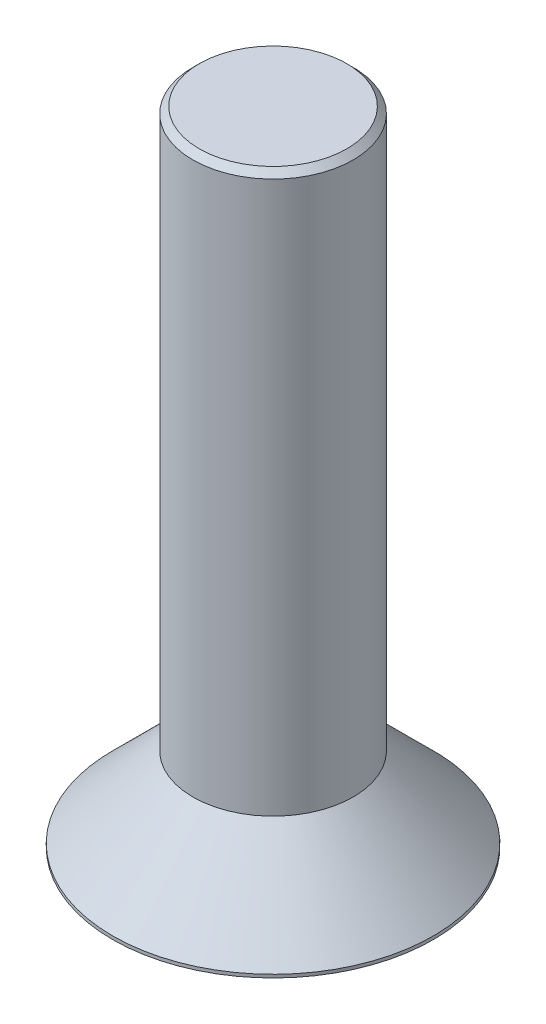
ISO-10303-21;
HEADER;
FILE_DESCRIPTION(('STEP AP214'),'2;1');
FILE_NAME('part.step','',(''),(''),'','','');
FILE_SCHEMA(('AUTOMOTIVE_DESIGN { 1 0 10303 214 1 1 1 1 }'));
ENDSEC;
DATA;
#1=APPLICATION_CONTEXT('core data for automotive mechanical design processes');
#2=APPLICATION_PROTOCOL_DEFINITION('international standard','automotive_design',2000,#1);
#3=PRODUCT_CONTEXT('',#1,'mechanical');
#4=PRODUCT('Part','Part','',(#3));
#5=PRODUCT_RELATED_PRODUCT_CATEGORY('part','',(#4));
#6=PRODUCT_DEFINITION_FORMATION('','',#4);
#7=PRODUCT_DEFINITION_CONTEXT('part definition',#1,'design');
#8=PRODUCT_DEFINITION('design','',#6,#7);
#9=PRODUCT_DEFINITION_SHAPE('','',#8);
#10=(LENGTH_UNIT() NAMED_UNIT(*) SI_UNIT(.MILLI.,.METRE.));
#11=(NAMED_UNIT(*) PLANE_ANGLE_UNIT() SI_UNIT($,.RADIAN.));
#12=(NAMED_UNIT(*) SI_UNIT($,.STERADIAN.) SOLID_ANGLE_UNIT());
#13=UNCERTAINTY_MEASURE_WITH_UNIT(LENGTH_MEASURE(1.E-05),#10,'distance_accuracy_value','');
#14=(GEOMETRIC_REPRESENTATION_CONTEXT(3) GLOBAL_UNCERTAINTY_ASSIGNED_CONTEXT((#13)) GLOBAL_UNIT_ASSIGNED_CONTEXT((#10,
#11,#12)) REPRESENTATION_CONTEXT('',''));
#15=CARTESIAN_POINT('',(0.,0.,0.));
#16=DIRECTION('',(0.,0.,1.));
#17=DIRECTION('',(1.,0.,0.));
#18=AXIS2_PLACEMENT_3D('',#15,#16,#17);
#19=CARTESIAN_POINT('',(0.,2.6,0.));
#20=DIRECTION('',(0.,-1.,0.));
#21=DIRECTION('',(0.,0.,-1.));
#22=AXIS2_PLACEMENT_3D('',#19,#20,#21);
#23=CYLINDRICAL_SURFACE('',#22,5.);
#24=CARTESIAN_POINT('',(0.,0.0999999999999916,0.));
#25=DIRECTION('',(0.,1.,0.));
#26=DIRECTION('',(0.,0.,1.));
#27=AXIS2_PLACEMENT_3D('',#24,#25,#26);
#28=CIRCLE('',#27,5.);
#29=CARTESIAN_POINT('',(0.,0.0999999999999916,5.));
#30=VERTEX_POINT('',#29);
#31=EDGE_CURVE('E151',#30,#30,#28,.F.);
#32=ORIENTED_EDGE('',*,*,#31,.T.);
#33=EDGE_LOOP('',(#32));
#34=FACE_BOUND('',#33,.T.);
#35=CARTESIAN_POINT('',(0.,0.,0.));
#36=DIRECTION('',(0.,1.,0.));
#37=DIRECTION('',(0.,0.,1.));
#38=AXIS2_PLACEMENT_3D('',#35,#36,#37);
#39=CIRCLE('',#38,5.);
#40=CARTESIAN_POINT('',(0.,0.,5.));
#41=VERTEX_POINT('',#40);
#42=EDGE_CURVE('E140',#41,#41,#39,.T.);
#43=ORIENTED_EDGE('',*,*,#42,.T.);
#44=EDGE_LOOP('',(#43));
#45=FACE_BOUND('',#44,.T.);
#46=ADVANCED_FACE('F37',(#34,#45),#23,.T.);
#47=CARTESIAN_POINT('',(0.,0.,0.));
#48=DIRECTION('',(0.,1.,0.));
#49=DIRECTION('',(0.,0.,1.));
#50=AXIS2_PLACEMENT_3D('',#47,#48,#49);
#51=PLANE('',#50);
#52=DIRECTION('',(0.,0.,1.));
#53=VECTOR('',#52,1.);
#54=CARTESIAN_POINT('',(1.54,0.,-0.889119414552024));
#55=LINE('',#54,#53);
#56=CARTESIAN_POINT('',(1.54,0.,-0.889119414552024));
#57=VERTEX_POINT('',#56);
#58=CARTESIAN_POINT('',(1.54,0.,0.889119414552024));
#59=VERTEX_POINT('',#58);
#60=EDGE_CURVE('E127',#57,#59,#55,.T.);
#61=ORIENTED_EDGE('',*,*,#60,.F.);
#62=DIRECTION('',(0.866025403784439,0.,0.5));
#63=VECTOR('',#62,1.);
#64=CARTESIAN_POINT('',(0.,0.,-1.77823882910405));
#65=LINE('',#64,#63);
#66=CARTESIAN_POINT('',(0.,0.,-1.77823882910405));
#67=VERTEX_POINT('',#66);
#68=EDGE_CURVE('E53',#67,#57,#65,.T.);
#69=ORIENTED_EDGE('',*,*,#68,.F.);
#70=DIRECTION('',(0.866025403784438,0.,-0.5));
#71=VECTOR('',#70,1.);
#72=CARTESIAN_POINT('',(-1.54,0.,-0.889119414552024));
#73=LINE('',#72,#71);
#74=CARTESIAN_POINT('',(-1.54,0.,-0.889119414552024));
#75=VERTEX_POINT('',#74);
#76=EDGE_CURVE('E136',#75,#67,#73,.T.);
#77=ORIENTED_EDGE('',*,*,#76,.F.);
#78=DIRECTION('',(0.,0.,-1.));
#79=VECTOR('',#78,1.);
#80=CARTESIAN_POINT('',(-1.54,0.,0.889119414552024));
#81=LINE('',#80,#79);
#82=CARTESIAN_POINT('',(-1.54,0.,0.889119414552024));
#83=VERTEX_POINT('',#82);
#84=EDGE_CURVE('E134',#83,#75,#81,.T.);
#85=ORIENTED_EDGE('',*,*,#84,.F.);
#86=DIRECTION('',(-0.866025403784439,0.,-0.5));
#87=VECTOR('',#86,1.);
#88=CARTESIAN_POINT('',(0.,0.,1.77823882910405));
#89=LINE('',#88,#87);
#90=CARTESIAN_POINT('',(0.,0.,1.77823882910405));
#91=VERTEX_POINT('',#90);
#92=EDGE_CURVE('E101',#91,#83,#89,.T.);
#93=ORIENTED_EDGE('',*,*,#92,.F.);
#94=DIRECTION('',(-0.866025403784439,0.,0.5));
#95=VECTOR('',#94,1.);
#96=CARTESIAN_POINT('',(1.54,0.,0.889119414552024));
#97=LINE('',#96,#95);
#98=EDGE_CURVE('E130',#59,#91,#97,.T.);
#99=ORIENTED_EDGE('',*,*,#98,.F.);
#100=EDGE_LOOP('',(#61,#69,#77,#85,#93,#99));
#101=FACE_BOUND('',#100,.T.);
#102=ORIENTED_EDGE('',*,*,#42,.F.);
#103=EDGE_LOOP('',(#102));
#104=FACE_BOUND('',#103,.T.);
#105=ADVANCED_FACE('F167',(#101,#104),#51,.F.);
#106=CARTESIAN_POINT('',(0.,2.6,0.));
#107=DIRECTION('',(0.,-1.,0.));
#108=DIRECTION('',(0.,0.,-1.));
#109=AXIS2_PLACEMENT_3D('',#106,#107,#108);
#110=CONICAL_SURFACE('',#109,2.5,0.785398163397447);
#111=ORIENTED_EDGE('',*,*,#31,.F.);
#112=EDGE_LOOP('',(#111));
#113=FACE_BOUND('',#112,.T.);
#114=CARTESIAN_POINT('',(0.,2.6,0.));
#115=DIRECTION('',(0.,1.,0.));
#116=DIRECTION('',(0.,0.,1.));
#117=AXIS2_PLACEMENT_3D('',#114,#115,#116);
#118=CIRCLE('',#117,2.5);
#119=CARTESIAN_POINT('',(0.,2.6,2.5));
#120=VERTEX_POINT('',#119);
#121=EDGE_CURVE('E148',#120,#120,#118,.T.);
#122=ORIENTED_EDGE('',*,*,#121,.F.);
#123=EDGE_LOOP('',(#122));
#124=FACE_BOUND('',#123,.T.);
#125=ADVANCED_FACE('F173',(#113,#124),#110,.T.);
#126=CARTESIAN_POINT('',(0.,0.95,-1.77823882910405));
#127=DIRECTION('',(0.5,0.,-0.866025403784439));
#128=DIRECTION('',(-0.866025403784439,0.,-0.5));
#129=AXIS2_PLACEMENT_3D('',#126,#127,#128);
#130=PLANE('',#129);
#131=ORIENTED_EDGE('',*,*,#68,.T.);
#132=DIRECTION('',(0.,-1.,0.));
#133=VECTOR('',#132,1.);
#134=CARTESIAN_POINT('',(1.54,0.95,-0.889119414552024));
#135=LINE('',#134,#133);
#136=CARTESIAN_POINT('',(1.54,0.95,-0.889119414552024));
#137=VERTEX_POINT('',#136);
#138=EDGE_CURVE('E83',#137,#57,#135,.T.);
#139=ORIENTED_EDGE('',*,*,#138,.F.);
#140=DIRECTION('',(0.866025403784439,0.,0.5));
#141=VECTOR('',#140,1.);
#142=CARTESIAN_POINT('',(0.,0.95,-1.77823882910405));
#143=LINE('',#142,#141);
#144=CARTESIAN_POINT('',(0.,0.95,-1.77823882910405));
#145=VERTEX_POINT('',#144);
#146=EDGE_CURVE('E138',#145,#137,#143,.T.);
#147=ORIENTED_EDGE('',*,*,#146,.F.);
#148=DIRECTION('',(0.,-1.,0.));
#149=VECTOR('',#148,1.);
#150=CARTESIAN_POINT('',(0.,0.95,-1.77823882910405));
#151=LINE('',#150,#149);
#152=EDGE_CURVE('E61',#145,#67,#151,.T.);
#153=ORIENTED_EDGE('',*,*,#152,.T.);
#154=EDGE_LOOP('',(#131,#139,#147,#153));
#155=FACE_BOUND('',#154,.T.);
#156=ADVANCED_FACE('F182',(#155),#130,.F.);
#157=CARTESIAN_POINT('',(-1.54,0.95,-0.889119414552024));
#158=DIRECTION('',(-0.5,0.,-0.866025403784439));
#159=DIRECTION('',(-0.866025403784439,0.,0.5));
#160=AXIS2_PLACEMENT_3D('',#157,#158,#159);
#161=PLANE('',#160);
#162=ORIENTED_EDGE('',*,*,#76,.T.);
#163=ORIENTED_EDGE('',*,*,#152,.F.);
#164=DIRECTION('',(0.866025403784438,0.,-0.5));
#165=VECTOR('',#164,1.);
#166=CARTESIAN_POINT('',(-1.54,0.95,-0.889119414552024));
#167=LINE('',#166,#165);
#168=CARTESIAN_POINT('',(-1.54,0.95,-0.889119414552024));
#169=VERTEX_POINT('',#168);
#170=EDGE_CURVE('E113',#169,#145,#167,.T.);
#171=ORIENTED_EDGE('',*,*,#170,.F.);
#172=DIRECTION('',(0.,-1.,0.));
#173=VECTOR('',#172,1.);
#174=CARTESIAN_POINT('',(-1.54,0.95,-0.889119414552024));
#175=LINE('',#174,#173);
#176=EDGE_CURVE('E105',#169,#75,#175,.T.);
#177=ORIENTED_EDGE('',*,*,#176,.T.);
#178=EDGE_LOOP('',(#162,#163,#171,#177));
#179=FACE_BOUND('',#178,.T.);
#180=ADVANCED_FACE('F187',(#179),#161,.F.);
#181=CARTESIAN_POINT('',(-1.54,0.95,0.889119414552024));
#182=DIRECTION('',(-1.,0.,0.));
#183=DIRECTION('',(0.,0.,1.));
#184=AXIS2_PLACEMENT_3D('',#181,#182,#183);
#185=PLANE('',#184);
#186=ORIENTED_EDGE('',*,*,#84,.T.);
#187=ORIENTED_EDGE('',*,*,#176,.F.);
#188=DIRECTION('',(0.,0.,-1.));
#189=VECTOR('',#188,1.);
#190=CARTESIAN_POINT('',(-1.54,0.95,0.889119414552024));
#191=LINE('',#190,#189);
#192=CARTESIAN_POINT('',(-1.54,0.95,0.889119414552024));
#193=VERTEX_POINT('',#192);
#194=EDGE_CURVE('E109',#193,#169,#191,.T.);
#195=ORIENTED_EDGE('',*,*,#194,.F.);
#196=DIRECTION('',(0.,-1.,0.));
#197=VECTOR('',#196,1.);
#198=CARTESIAN_POINT('',(-1.54,0.95,0.889119414552024));
#199=LINE('',#198,#197);
#200=EDGE_CURVE('E94',#193,#83,#199,.T.);
#201=ORIENTED_EDGE('',*,*,#200,.T.);
#202=EDGE_LOOP('',(#186,#187,#195,#201));
#203=FACE_BOUND('',#202,.T.);
#204=ADVANCED_FACE('F110',(#203),#185,.F.);
#205=CARTESIAN_POINT('',(0.,0.95,1.77823882910405));
#206=DIRECTION('',(-0.5,0.,0.866025403784439));
#207=DIRECTION('',(0.866025403784439,0.,0.5));
#208=AXIS2_PLACEMENT_3D('',#205,#206,#207);
#209=PLANE('',#208);
#210=ORIENTED_EDGE('',*,*,#92,.T.);
#211=ORIENTED_EDGE('',*,*,#200,.F.);
#212=DIRECTION('',(-0.866025403784439,0.,-0.5));
#213=VECTOR('',#212,1.);
#214=CARTESIAN_POINT('',(0.,0.95,1.77823882910405));
#215=LINE('',#214,#213);
#216=CARTESIAN_POINT('',(0.,0.95,1.77823882910405));
#217=VERTEX_POINT('',#216);
#218=EDGE_CURVE('E98',#217,#193,#215,.T.);
#219=ORIENTED_EDGE('',*,*,#218,.F.);
#220=DIRECTION('',(0.,-1.,0.));
#221=VECTOR('',#220,1.);
#222=CARTESIAN_POINT('',(0.,0.95,1.77823882910405));
#223=LINE('',#222,#221);
#224=EDGE_CURVE('E106',#217,#91,#223,.T.);
#225=ORIENTED_EDGE('',*,*,#224,.T.);
#226=EDGE_LOOP('',(#210,#211,#219,#225));
#227=FACE_BOUND('',#226,.T.);
#228=ADVANCED_FACE('F96',(#227),#209,.F.);
#229=CARTESIAN_POINT('',(1.54,0.95,0.889119414552024));
#230=DIRECTION('',(0.5,0.,0.866025403784439));
#231=DIRECTION('',(0.866025403784439,0.,-0.5));
#232=AXIS2_PLACEMENT_3D('',#229,#230,#231);
#233=PLANE('',#232);
#234=ORIENTED_EDGE('',*,*,#98,.T.);
#235=ORIENTED_EDGE('',*,*,#224,.F.);
#236=DIRECTION('',(-0.866025403784439,0.,0.5));
#237=VECTOR('',#236,1.);
#238=CARTESIAN_POINT('',(1.54,0.95,0.889119414552024));
#239=LINE('',#238,#237);
#240=CARTESIAN_POINT('',(1.54,0.95,0.889119414552024));
#241=VERTEX_POINT('',#240);
#242=EDGE_CURVE('E119',#241,#217,#239,.T.);
#243=ORIENTED_EDGE('',*,*,#242,.F.);
#244=DIRECTION('',(0.,-1.,0.));
#245=VECTOR('',#244,1.);
#246=CARTESIAN_POINT('',(1.54,0.95,0.889119414552024));
#247=LINE('',#246,#245);
#248=EDGE_CURVE('E143',#241,#59,#247,.T.);
#249=ORIENTED_EDGE('',*,*,#248,.T.);
#250=EDGE_LOOP('',(#234,#235,#243,#249));
#251=FACE_BOUND('',#250,.T.);
#252=ADVANCED_FACE('F207',(#251),#233,.F.);
#253=CARTESIAN_POINT('',(1.54,0.95,-0.889119414552024));
#254=DIRECTION('',(1.,0.,0.));
#255=DIRECTION('',(0.,0.,-1.));
#256=AXIS2_PLACEMENT_3D('',#253,#254,#255);
#257=PLANE('',#256);
#258=ORIENTED_EDGE('',*,*,#60,.T.);
#259=ORIENTED_EDGE('',*,*,#248,.F.);
#260=DIRECTION('',(0.,0.,1.));
#261=VECTOR('',#260,1.);
#262=CARTESIAN_POINT('',(1.54,0.95,-0.889119414552024));
#263=LINE('',#262,#261);
#264=EDGE_CURVE('E121',#137,#241,#263,.T.);
#265=ORIENTED_EDGE('',*,*,#264,.F.);
#266=ORIENTED_EDGE('',*,*,#138,.T.);
#267=EDGE_LOOP('',(#258,#259,#265,#266));
#268=FACE_BOUND('',#267,.T.);
#269=ADVANCED_FACE('F198',(#268),#257,.F.);
#270=CARTESIAN_POINT('',(0.,0.95,0.));
#271=DIRECTION('',(0.,-1.,0.));
#272=DIRECTION('',(0.,0.,-1.));
#273=AXIS2_PLACEMENT_3D('',#270,#271,#272);
#274=PLANE('',#273);
#275=ORIENTED_EDGE('',*,*,#146,.T.);
#276=ORIENTED_EDGE('',*,*,#264,.T.);
#277=ORIENTED_EDGE('',*,*,#242,.T.);
#278=ORIENTED_EDGE('',*,*,#218,.T.);
#279=ORIENTED_EDGE('',*,*,#194,.T.);
#280=ORIENTED_EDGE('',*,*,#170,.T.);
#281=EDGE_LOOP('',(#275,#276,#277,#278,#279,#280));
#282=FACE_BOUND('',#281,.T.);
#283=ADVANCED_FACE('F116',(#282),#274,.T.);
#284=CARTESIAN_POINT('',(0.,20.,0.));
#285=DIRECTION('',(0.,-1.,0.));
#286=DIRECTION('',(0.,0.,-1.));
#287=AXIS2_PLACEMENT_3D('',#284,#285,#286);
#288=CYLINDRICAL_SURFACE('',#287,2.5);
#289=CARTESIAN_POINT('',(0.,19.8,0.));
#290=DIRECTION('',(0.,1.,0.));
#291=DIRECTION('',(0.,0.,1.));
#292=AXIS2_PLACEMENT_3D('',#289,#290,#291);
#293=CIRCLE('',#292,2.5);
#294=CARTESIAN_POINT('',(0.,19.8,2.5));
#295=VERTEX_POINT('',#294);
#296=EDGE_CURVE('E11',#295,#295,#293,.F.);
#297=ORIENTED_EDGE('',*,*,#296,.T.);
#298=EDGE_LOOP('',(#297));
#299=FACE_BOUND('',#298,.T.);
#300=ORIENTED_EDGE('',*,*,#121,.T.);
#301=EDGE_LOOP('',(#300));
#302=FACE_BOUND('',#301,.T.);
#303=ADVANCED_FACE('F163',(#299,#302),#288,.T.);
#304=CARTESIAN_POINT('',(0.,20.,0.));
#305=DIRECTION('',(0.,1.,0.));
#306=DIRECTION('',(0.,0.,1.));
#307=AXIS2_PLACEMENT_3D('',#304,#305,#306);
#308=PLANE('',#307);
#309=CARTESIAN_POINT('',(0.,20.,0.));
#310=DIRECTION('',(0.,1.,0.));
#311=DIRECTION('',(0.,0.,1.));
#312=AXIS2_PLACEMENT_3D('',#309,#310,#311);
#313=CIRCLE('',#312,2.3);
#314=CARTESIAN_POINT('',(0.,20.,2.3));
#315=VERTEX_POINT('',#314);
#316=EDGE_CURVE('E46',#315,#315,#313,.T.);
#317=ORIENTED_EDGE('',*,*,#316,.T.);
#318=EDGE_LOOP('',(#317));
#319=FACE_BOUND('',#318,.T.);
#320=ADVANCED_FACE('F156',(#319),#308,.T.);
#321=CARTESIAN_POINT('',(0.,20.,0.));
#322=DIRECTION('',(0.,-1.,0.));
#323=DIRECTION('',(0.,0.,-1.));
#324=AXIS2_PLACEMENT_3D('',#321,#322,#323);
#325=CONICAL_SURFACE('',#324,2.3,0.785398163397443);
#326=ORIENTED_EDGE('',*,*,#296,.F.);
#327=EDGE_LOOP('',(#326));
#328=FACE_BOUND('',#327,.T.);
#329=ORIENTED_EDGE('',*,*,#316,.F.);
#330=EDGE_LOOP('',(#329));
#331=FACE_BOUND('',#330,.T.);
#332=ADVANCED_FACE('F40',(#328,#331),#325,.T.);
#333=CLOSED_SHELL('',(#46,#105,#125,#156,#180,#204,#228,#252,#269,#283,#303,#320,#332));
#334=MANIFOLD_SOLID_BREP('B2',#333);
#335=ADVANCED_BREP_SHAPE_REPRESENTATION('',(#18,#334),#14);
#336=SHAPE_DEFINITION_REPRESENTATION(#9,#335);
ENDSEC;
END-ISO-10303-21;
